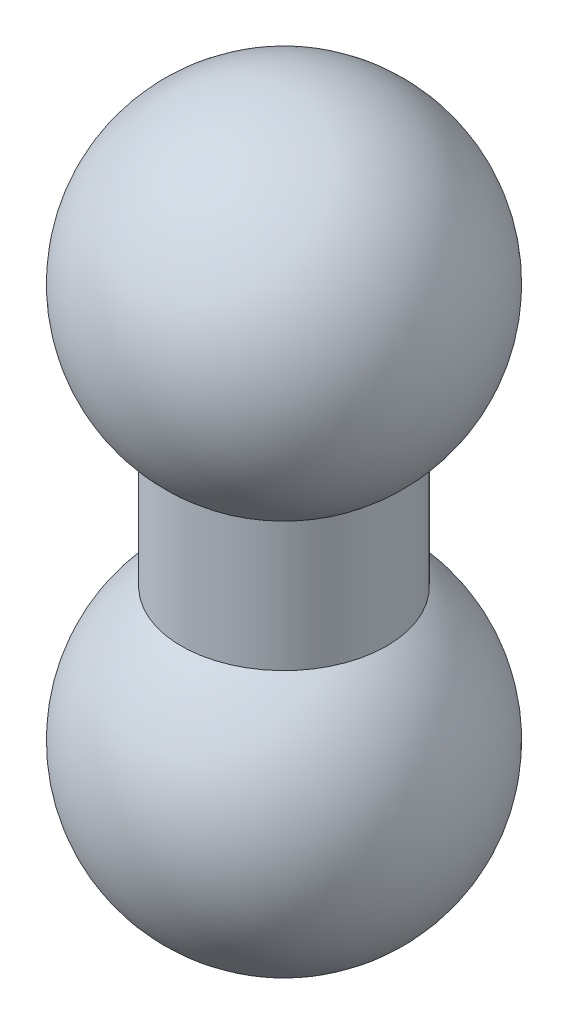
ISO-10303-21;
HEADER;
FILE_DESCRIPTION(('STEP AP214'),'2;1');
FILE_NAME('part.step','',(''),(''),'','','');
FILE_SCHEMA(('AUTOMOTIVE_DESIGN { 1 0 10303 214 1 1 1 1 }'));
ENDSEC;
DATA;
#1=APPLICATION_CONTEXT('core data for automotive mechanical design processes');
#2=APPLICATION_PROTOCOL_DEFINITION('international standard','automotive_design',2000,#1);
#3=PRODUCT_CONTEXT('',#1,'mechanical');
#4=PRODUCT('Part','Part','',(#3));
#5=PRODUCT_RELATED_PRODUCT_CATEGORY('part','',(#4));
#6=PRODUCT_DEFINITION_FORMATION('','',#4);
#7=PRODUCT_DEFINITION_CONTEXT('part definition',#1,'design');
#8=PRODUCT_DEFINITION('design','',#6,#7);
#9=PRODUCT_DEFINITION_SHAPE('','',#8);
#10=(LENGTH_UNIT() NAMED_UNIT(*) SI_UNIT(.MILLI.,.METRE.));
#11=(NAMED_UNIT(*) PLANE_ANGLE_UNIT() SI_UNIT($,.RADIAN.));
#12=(NAMED_UNIT(*) SI_UNIT($,.STERADIAN.) SOLID_ANGLE_UNIT());
#13=UNCERTAINTY_MEASURE_WITH_UNIT(LENGTH_MEASURE(1.E-05),#10,'distance_accuracy_value','');
#14=(GEOMETRIC_REPRESENTATION_CONTEXT(3) GLOBAL_UNCERTAINTY_ASSIGNED_CONTEXT((#13)) GLOBAL_UNIT_ASSIGNED_CONTEXT((#10,
#11,#12)) REPRESENTATION_CONTEXT('',''));
#15=CARTESIAN_POINT('',(0.,0.,0.));
#16=DIRECTION('',(0.,0.,1.));
#17=DIRECTION('',(1.,0.,0.));
#18=AXIS2_PLACEMENT_3D('',#15,#16,#17);
#19=CARTESIAN_POINT('',(0.,25.4,0.));
#20=DIRECTION('',(0.,1.,0.));
#21=DIRECTION('',(1.,0.,0.));
#22=AXIS2_PLACEMENT_3D('',#19,#20,#21);
#23=SPHERICAL_SURFACE('',#22,21.59);
#24=CARTESIAN_POINT('',(0.,8.31486267062464,0.));
#25=DIRECTION('',(0.,1.,0.));
#26=DIRECTION('',(-1.,0.,0.));
#27=AXIS2_PLACEMENT_3D('',#24,#25,#26);
#28=CIRCLE('',#27,13.1994765970619);
#29=CARTESIAN_POINT('',(-13.1994765970619,8.31486267062464,0.));
#30=VERTEX_POINT('',#29);
#31=EDGE_CURVE('E52',#30,#30,#28,.T.);
#32=ORIENTED_EDGE('',*,*,#31,.T.);
#33=EDGE_LOOP('',(#32));
#34=FACE_BOUND('',#33,.T.);
#35=ADVANCED_FACE('F36',(#34),#23,.T.);
#36=CARTESIAN_POINT('',(0.,-25.4,0.));
#37=DIRECTION('',(0.,1.,0.));
#38=DIRECTION('',(-1.,0.,0.));
#39=AXIS2_PLACEMENT_3D('',#36,#37,#38);
#40=SPHERICAL_SURFACE('',#39,21.59);
#41=CARTESIAN_POINT('',(0.,-8.31486267062464,0.));
#42=DIRECTION('',(0.,1.,0.));
#43=DIRECTION('',(-1.,0.,0.));
#44=AXIS2_PLACEMENT_3D('',#41,#42,#43);
#45=CIRCLE('',#44,13.1994765970619);
#46=CARTESIAN_POINT('',(-13.1994765970619,-8.31486267062464,0.));
#47=VERTEX_POINT('',#46);
#48=EDGE_CURVE('E47',#47,#47,#45,.T.);
#49=ORIENTED_EDGE('',*,*,#48,.F.);
#50=EDGE_LOOP('',(#49));
#51=FACE_BOUND('',#50,.T.);
#52=ADVANCED_FACE('F61',(#51),#40,.T.);
#53=CARTESIAN_POINT('',(0.,50.0102857174056,0.));
#54=DIRECTION('',(0.,1.,0.));
#55=DIRECTION('',(-1.,0.,0.));
#56=AXIS2_PLACEMENT_3D('',#53,#54,#55);
#57=CYLINDRICAL_SURFACE('',#56,13.1994765970619);
#58=ORIENTED_EDGE('',*,*,#31,.F.);
#59=EDGE_LOOP('',(#58));
#60=FACE_BOUND('',#59,.T.);
#61=ORIENTED_EDGE('',*,*,#48,.T.);
#62=EDGE_LOOP('',(#61));
#63=FACE_BOUND('',#62,.T.);
#64=ADVANCED_FACE('F58',(#60,#63),#57,.T.);
#65=CLOSED_SHELL('',(#35,#52,#64));
#66=CARTESIAN_POINT('',(0.,25.4,0.));
#67=DIRECTION('',(0.,1.,0.));
#68=DIRECTION('',(1.,0.,0.));
#69=AXIS2_PLACEMENT_3D('',#66,#67,#68);
#70=SPHERICAL_SURFACE('',#69,19.05);
#71=CARTESIAN_POINT('',(0.,9.61145799395366,0.));
#72=DIRECTION('',(0.,1.,0.));
#73=DIRECTION('',(-1.,0.,0.));
#74=AXIS2_PLACEMENT_3D('',#71,#72,#73);
#75=CIRCLE('',#74,10.6594765970619);
#76=CARTESIAN_POINT('',(-10.6594765970619,9.61145799395366,0.));
#77=VERTEX_POINT('',#76);
#78=EDGE_CURVE('E10',#77,#77,#75,.T.);
#79=ORIENTED_EDGE('',*,*,#78,.F.);
#80=EDGE_LOOP('',(#79));
#81=FACE_BOUND('',#80,.T.);
#82=ADVANCED_FACE('F80',(#81),#70,.F.);
#83=CARTESIAN_POINT('',(0.,50.0102857174056,0.));
#84=DIRECTION('',(0.,1.,0.));
#85=DIRECTION('',(-1.,0.,0.));
#86=AXIS2_PLACEMENT_3D('',#83,#84,#85);
#87=CYLINDRICAL_SURFACE('',#86,10.6594765970619);
#88=ORIENTED_EDGE('',*,*,#78,.T.);
#89=EDGE_LOOP('',(#88));
#90=FACE_BOUND('',#89,.T.);
#91=CARTESIAN_POINT('',(0.,-9.61145799395366,0.));
#92=DIRECTION('',(0.,1.,0.));
#93=DIRECTION('',(-1.,0.,0.));
#94=AXIS2_PLACEMENT_3D('',#91,#92,#93);
#95=CIRCLE('',#94,10.6594765970619);
#96=CARTESIAN_POINT('',(-10.6594765970619,-9.61145799395366,0.));
#97=VERTEX_POINT('',#96);
#98=EDGE_CURVE('E44',#97,#97,#95,.T.);
#99=ORIENTED_EDGE('',*,*,#98,.F.);
#100=EDGE_LOOP('',(#99));
#101=FACE_BOUND('',#100,.T.);
#102=ADVANCED_FACE('F78',(#90,#101),#87,.F.);
#103=CARTESIAN_POINT('',(0.,-25.4,0.));
#104=DIRECTION('',(0.,1.,0.));
#105=DIRECTION('',(-1.,0.,0.));
#106=AXIS2_PLACEMENT_3D('',#103,#104,#105);
#107=SPHERICAL_SURFACE('',#106,19.05);
#108=ORIENTED_EDGE('',*,*,#98,.T.);
#109=EDGE_LOOP('',(#108));
#110=FACE_BOUND('',#109,.T.);
#111=ADVANCED_FACE('F71',(#110),#107,.F.);
#112=CLOSED_SHELL('',(#82,#102,#111));
#113=ORIENTED_CLOSED_SHELL('',*,#112,.T.);
#114=BREP_WITH_VOIDS('B2',#65,(#113));
#115=ADVANCED_BREP_SHAPE_REPRESENTATION('',(#18,#114),#14);
#116=SHAPE_DEFINITION_REPRESENTATION(#9,#115);
ENDSEC;
END-ISO-10303-21;
